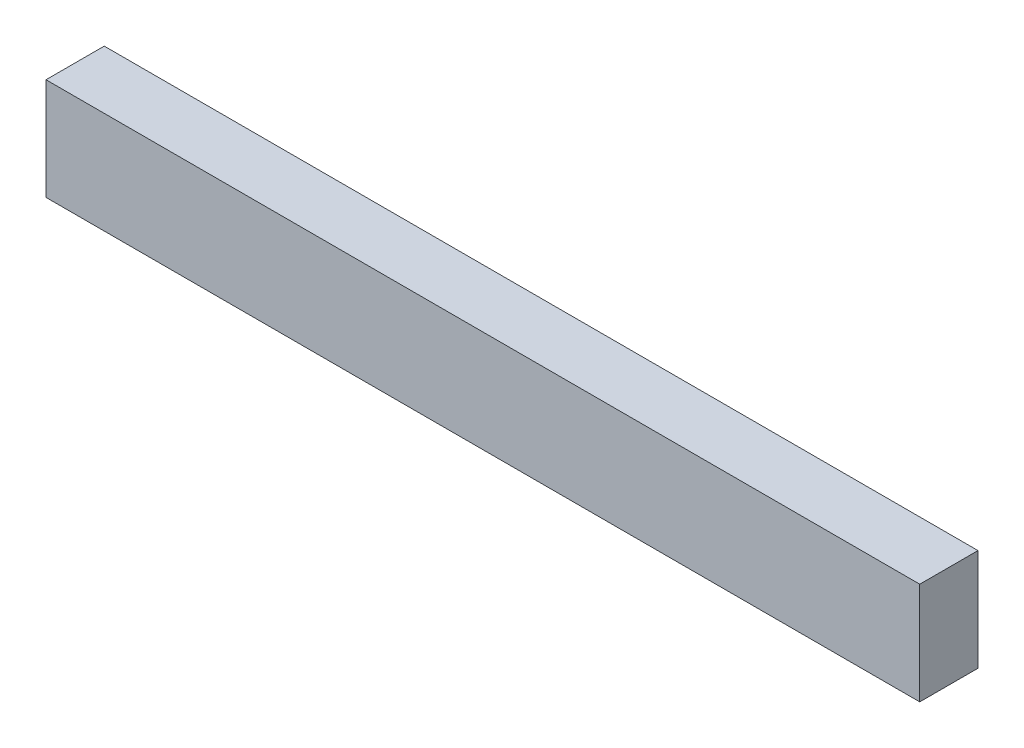
ISO-10303-21;
HEADER;
FILE_DESCRIPTION(('STEP AP214'),'2;1');
FILE_NAME('part.step','',(''),(''),'','','');
FILE_SCHEMA(('AUTOMOTIVE_DESIGN { 1 0 10303 214 1 1 1 1 }'));
ENDSEC;
DATA;
#1=APPLICATION_CONTEXT('core data for automotive mechanical design processes');
#2=APPLICATION_PROTOCOL_DEFINITION('international standard','automotive_design',2000,#1);
#3=PRODUCT_CONTEXT('',#1,'mechanical');
#4=PRODUCT('Part','Part','',(#3));
#5=PRODUCT_RELATED_PRODUCT_CATEGORY('part','',(#4));
#6=PRODUCT_DEFINITION_FORMATION('','',#4);
#7=PRODUCT_DEFINITION_CONTEXT('part definition',#1,'design');
#8=PRODUCT_DEFINITION('design','',#6,#7);
#9=PRODUCT_DEFINITION_SHAPE('','',#8);
#10=(LENGTH_UNIT() NAMED_UNIT(*) SI_UNIT(.MILLI.,.METRE.));
#11=(NAMED_UNIT(*) PLANE_ANGLE_UNIT() SI_UNIT($,.RADIAN.));
#12=(NAMED_UNIT(*) SI_UNIT($,.STERADIAN.) SOLID_ANGLE_UNIT());
#13=UNCERTAINTY_MEASURE_WITH_UNIT(LENGTH_MEASURE(1.E-05),#10,'distance_accuracy_value','');
#14=(GEOMETRIC_REPRESENTATION_CONTEXT(3) GLOBAL_UNCERTAINTY_ASSIGNED_CONTEXT((#13)) GLOBAL_UNIT_ASSIGNED_CONTEXT((#10,
#11,#12)) REPRESENTATION_CONTEXT('',''));
#15=CARTESIAN_POINT('',(0.,0.,0.));
#16=DIRECTION('',(0.,0.,1.));
#17=DIRECTION('',(1.,0.,0.));
#18=AXIS2_PLACEMENT_3D('',#15,#16,#17);
#19=CARTESIAN_POINT('',(-14.4874074074074,16.2160185185185,10.16));
#20=DIRECTION('',(1.,0.,0.));
#21=DIRECTION('',(0.,0.,-1.));
#22=AXIS2_PLACEMENT_3D('',#19,#20,#21);
#23=PLANE('',#22);
#24=DIRECTION('',(0.,-1.,0.));
#25=VECTOR('',#24,1.);
#26=CARTESIAN_POINT('',(-14.4874074074074,16.2160185185185,0.));
#27=LINE('',#26,#25);
#28=CARTESIAN_POINT('',(-14.4874074074074,16.2160185185185,0.));
#29=VERTEX_POINT('',#28);
#30=CARTESIAN_POINT('',(-14.4874074074074,-1.56398148148148,0.));
#31=VERTEX_POINT('',#30);
#32=EDGE_CURVE('E96',#29,#31,#27,.T.);
#33=ORIENTED_EDGE('',*,*,#32,.T.);
#34=DIRECTION('',(0.,0.,-1.));
#35=VECTOR('',#34,1.);
#36=CARTESIAN_POINT('',(-14.4874074074074,-1.56398148148148,10.16));
#37=LINE('',#36,#35);
#38=CARTESIAN_POINT('',(-14.4874074074074,-1.56398148148148,10.16));
#39=VERTEX_POINT('',#38);
#40=EDGE_CURVE('E11',#39,#31,#37,.T.);
#41=ORIENTED_EDGE('',*,*,#40,.F.);
#42=DIRECTION('',(0.,-1.,0.));
#43=VECTOR('',#42,1.);
#44=CARTESIAN_POINT('',(-14.4874074074074,16.2160185185185,10.16));
#45=LINE('',#44,#43);
#46=CARTESIAN_POINT('',(-14.4874074074074,16.2160185185185,10.16));
#47=VERTEX_POINT('',#46);
#48=EDGE_CURVE('E84',#47,#39,#45,.T.);
#49=ORIENTED_EDGE('',*,*,#48,.F.);
#50=DIRECTION('',(0.,0.,-1.));
#51=VECTOR('',#50,1.);
#52=CARTESIAN_POINT('',(-14.4874074074074,16.2160185185185,10.16));
#53=LINE('',#52,#51);
#54=EDGE_CURVE('E92',#47,#29,#53,.T.);
#55=ORIENTED_EDGE('',*,*,#54,.T.);
#56=EDGE_LOOP('',(#33,#41,#49,#55));
#57=FACE_BOUND('',#56,.T.);
#58=ADVANCED_FACE('F33',(#57),#23,.F.);
#59=CARTESIAN_POINT('',(-14.4874074074074,-1.56398148148148,10.16));
#60=DIRECTION('',(0.,1.,0.));
#61=DIRECTION('',(-1.,0.,0.));
#62=AXIS2_PLACEMENT_3D('',#59,#60,#61);
#63=PLANE('',#62);
#64=DIRECTION('',(1.,0.,0.));
#65=VECTOR('',#64,1.);
#66=CARTESIAN_POINT('',(-14.4874074074074,-1.56398148148148,0.));
#67=LINE('',#66,#65);
#68=CARTESIAN_POINT('',(137.912592592593,-1.56398148148149,0.));
#69=VERTEX_POINT('',#68);
#70=EDGE_CURVE('E88',#31,#69,#67,.T.);
#71=ORIENTED_EDGE('',*,*,#70,.T.);
#72=DIRECTION('',(0.,0.,-1.));
#73=VECTOR('',#72,1.);
#74=CARTESIAN_POINT('',(137.912592592593,-1.56398148148149,10.16));
#75=LINE('',#74,#73);
#76=CARTESIAN_POINT('',(137.912592592593,-1.56398148148149,10.16));
#77=VERTEX_POINT('',#76);
#78=EDGE_CURVE('E41',#77,#69,#75,.T.);
#79=ORIENTED_EDGE('',*,*,#78,.F.);
#80=DIRECTION('',(1.,0.,0.));
#81=VECTOR('',#80,1.);
#82=CARTESIAN_POINT('',(-14.4874074074074,-1.56398148148148,10.16));
#83=LINE('',#82,#81);
#84=EDGE_CURVE('E79',#39,#77,#83,.T.);
#85=ORIENTED_EDGE('',*,*,#84,.F.);
#86=ORIENTED_EDGE('',*,*,#40,.T.);
#87=EDGE_LOOP('',(#71,#79,#85,#86));
#88=FACE_BOUND('',#87,.T.);
#89=ADVANCED_FACE('F87',(#88),#63,.F.);
#90=CARTESIAN_POINT('',(137.912592592593,16.2160185185185,10.16));
#91=DIRECTION('',(-1.,0.,0.));
#92=DIRECTION('',(0.,0.,1.));
#93=AXIS2_PLACEMENT_3D('',#90,#91,#92);
#94=PLANE('',#93);
#95=DIRECTION('',(0.,1.,0.));
#96=VECTOR('',#95,1.);
#97=CARTESIAN_POINT('',(137.912592592593,16.2160185185185,0.));
#98=LINE('',#97,#96);
#99=CARTESIAN_POINT('',(137.912592592593,16.2160185185185,0.));
#100=VERTEX_POINT('',#99);
#101=EDGE_CURVE('E66',#69,#100,#98,.T.);
#102=ORIENTED_EDGE('',*,*,#101,.T.);
#103=DIRECTION('',(0.,0.,-1.));
#104=VECTOR('',#103,1.);
#105=CARTESIAN_POINT('',(137.912592592593,16.2160185185185,10.16));
#106=LINE('',#105,#104);
#107=CARTESIAN_POINT('',(137.912592592593,16.2160185185185,10.16));
#108=VERTEX_POINT('',#107);
#109=EDGE_CURVE('E89',#108,#100,#106,.T.);
#110=ORIENTED_EDGE('',*,*,#109,.F.);
#111=DIRECTION('',(0.,1.,0.));
#112=VECTOR('',#111,1.);
#113=CARTESIAN_POINT('',(137.912592592593,16.2160185185185,10.16));
#114=LINE('',#113,#112);
#115=EDGE_CURVE('E82',#77,#108,#114,.T.);
#116=ORIENTED_EDGE('',*,*,#115,.F.);
#117=ORIENTED_EDGE('',*,*,#78,.T.);
#118=EDGE_LOOP('',(#102,#110,#116,#117));
#119=FACE_BOUND('',#118,.T.);
#120=ADVANCED_FACE('F90',(#119),#94,.F.);
#121=CARTESIAN_POINT('',(-14.4874074074074,16.2160185185185,10.16));
#122=DIRECTION('',(0.,-1.,0.));
#123=DIRECTION('',(0.,0.,-1.));
#124=AXIS2_PLACEMENT_3D('',#121,#122,#123);
#125=PLANE('',#124);
#126=DIRECTION('',(-1.,0.,0.));
#127=VECTOR('',#126,1.);
#128=CARTESIAN_POINT('',(-14.4874074074074,16.2160185185185,0.));
#129=LINE('',#128,#127);
#130=EDGE_CURVE('E72',#100,#29,#129,.T.);
#131=ORIENTED_EDGE('',*,*,#130,.T.);
#132=ORIENTED_EDGE('',*,*,#54,.F.);
#133=DIRECTION('',(-1.,0.,0.));
#134=VECTOR('',#133,1.);
#135=CARTESIAN_POINT('',(-14.4874074074074,16.2160185185185,10.16));
#136=LINE('',#135,#134);
#137=EDGE_CURVE('E49',#108,#47,#136,.T.);
#138=ORIENTED_EDGE('',*,*,#137,.F.);
#139=ORIENTED_EDGE('',*,*,#109,.T.);
#140=EDGE_LOOP('',(#131,#132,#138,#139));
#141=FACE_BOUND('',#140,.T.);
#142=ADVANCED_FACE('F103',(#141),#125,.F.);
#143=CARTESIAN_POINT('',(0.,0.,10.16));
#144=DIRECTION('',(0.,0.,1.));
#145=DIRECTION('',(1.,0.,0.));
#146=AXIS2_PLACEMENT_3D('',#143,#144,#145);
#147=PLANE('',#146);
#148=ORIENTED_EDGE('',*,*,#48,.T.);
#149=ORIENTED_EDGE('',*,*,#84,.T.);
#150=ORIENTED_EDGE('',*,*,#115,.T.);
#151=ORIENTED_EDGE('',*,*,#137,.T.);
#152=EDGE_LOOP('',(#148,#149,#150,#151));
#153=FACE_BOUND('',#152,.T.);
#154=ADVANCED_FACE('F80',(#153),#147,.T.);
#155=CARTESIAN_POINT('',(0.,0.,0.));
#156=DIRECTION('',(0.,0.,1.));
#157=DIRECTION('',(1.,0.,0.));
#158=AXIS2_PLACEMENT_3D('',#155,#156,#157);
#159=PLANE('',#158);
#160=ORIENTED_EDGE('',*,*,#32,.F.);
#161=ORIENTED_EDGE('',*,*,#130,.F.);
#162=ORIENTED_EDGE('',*,*,#101,.F.);
#163=ORIENTED_EDGE('',*,*,#70,.F.);
#164=EDGE_LOOP('',(#160,#161,#162,#163));
#165=FACE_BOUND('',#164,.T.);
#166=ADVANCED_FACE('F106',(#165),#159,.F.);
#167=CLOSED_SHELL('',(#58,#89,#120,#142,#154,#166));
#168=MANIFOLD_SOLID_BREP('B2',#167);
#169=ADVANCED_BREP_SHAPE_REPRESENTATION('',(#18,#168),#14);
#170=SHAPE_DEFINITION_REPRESENTATION(#9,#169);
ENDSEC;
END-ISO-10303-21;
